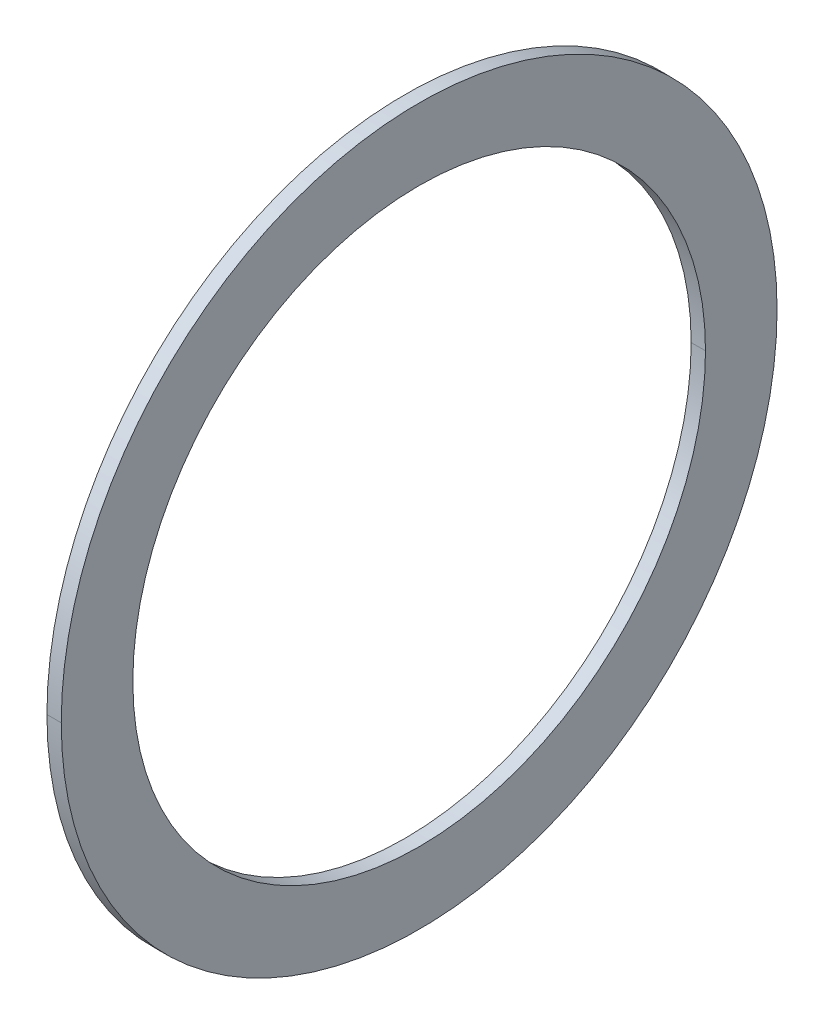
ISO-10303-21;
HEADER;
FILE_DESCRIPTION(('STEP AP214'),'2;1');
FILE_NAME('part.step','',(''),(''),'','','');
FILE_SCHEMA(('AUTOMOTIVE_DESIGN { 1 0 10303 214 1 1 1 1 }'));
ENDSEC;
DATA;
#1=APPLICATION_CONTEXT('core data for automotive mechanical design processes');
#2=APPLICATION_PROTOCOL_DEFINITION('international standard','automotive_design',2000,#1);
#3=PRODUCT_CONTEXT('',#1,'mechanical');
#4=PRODUCT('Part','Part','',(#3));
#5=PRODUCT_RELATED_PRODUCT_CATEGORY('part','',(#4));
#6=PRODUCT_DEFINITION_FORMATION('','',#4);
#7=PRODUCT_DEFINITION_CONTEXT('part definition',#1,'design');
#8=PRODUCT_DEFINITION('design','',#6,#7);
#9=PRODUCT_DEFINITION_SHAPE('','',#8);
#10=(LENGTH_UNIT() NAMED_UNIT(*) SI_UNIT(.MILLI.,.METRE.));
#11=(NAMED_UNIT(*) PLANE_ANGLE_UNIT() SI_UNIT($,.RADIAN.));
#12=(NAMED_UNIT(*) SI_UNIT($,.STERADIAN.) SOLID_ANGLE_UNIT());
#13=UNCERTAINTY_MEASURE_WITH_UNIT(LENGTH_MEASURE(1.E-05),#10,'distance_accuracy_value','');
#14=(GEOMETRIC_REPRESENTATION_CONTEXT(3) GLOBAL_UNCERTAINTY_ASSIGNED_CONTEXT((#13)) GLOBAL_UNIT_ASSIGNED_CONTEXT((#10,
#11,#12)) REPRESENTATION_CONTEXT('',''));
#15=CARTESIAN_POINT('',(0.,0.,0.));
#16=DIRECTION('',(0.,0.,1.));
#17=DIRECTION('',(1.,0.,0.));
#18=AXIS2_PLACEMENT_3D('',#15,#16,#17);
#19=CARTESIAN_POINT('',(2.,0.,0.));
#20=DIRECTION('',(-1.,0.,0.));
#21=DIRECTION('',(0.,1.,0.));
#22=AXIS2_PLACEMENT_3D('',#19,#20,#21);
#23=CYLINDRICAL_SURFACE('',#22,80.);
#24=DIRECTION('',(-1.,0.,0.));
#25=VECTOR('',#24,1.);
#26=CARTESIAN_POINT('',(2.,0.,-80.));
#27=LINE('',#26,#25);
#28=CARTESIAN_POINT('',(2.,0.,-80.));
#29=VERTEX_POINT('',#28);
#30=CARTESIAN_POINT('',(-2.,0.,-80.));
#31=VERTEX_POINT('',#30);
#32=EDGE_CURVE('E11',#29,#31,#27,.T.);
#33=ORIENTED_EDGE('',*,*,#32,.T.);
#34=CARTESIAN_POINT('',(-2.,0.,0.));
#35=DIRECTION('',(1.,0.,0.));
#36=DIRECTION('',(0.,0.,-1.));
#37=AXIS2_PLACEMENT_3D('',#34,#35,#36);
#38=CIRCLE('',#37,80.);
#39=CARTESIAN_POINT('',(-2.,0.,80.));
#40=VERTEX_POINT('',#39);
#41=EDGE_CURVE('E25',#40,#31,#38,.T.);
#42=ORIENTED_EDGE('',*,*,#41,.F.);
#43=DIRECTION('',(-1.,0.,0.));
#44=VECTOR('',#43,1.);
#45=CARTESIAN_POINT('',(2.,0.,80.));
#46=LINE('',#45,#44);
#47=CARTESIAN_POINT('',(2.,0.,80.));
#48=VERTEX_POINT('',#47);
#49=EDGE_CURVE('E94',#48,#40,#46,.T.);
#50=ORIENTED_EDGE('',*,*,#49,.F.);
#51=CARTESIAN_POINT('',(2.,0.,0.));
#52=DIRECTION('',(1.,0.,0.));
#53=DIRECTION('',(0.,0.,-1.));
#54=AXIS2_PLACEMENT_3D('',#51,#52,#53);
#55=CIRCLE('',#54,80.);
#56=EDGE_CURVE('E90',#48,#29,#55,.T.);
#57=ORIENTED_EDGE('',*,*,#56,.T.);
#58=EDGE_LOOP('',(#33,#42,#50,#57));
#59=FACE_BOUND('',#58,.T.);
#60=ADVANCED_FACE('F17',(#59),#23,.F.);
#61=CARTESIAN_POINT('',(2.,0.,0.));
#62=DIRECTION('',(1.,0.,0.));
#63=DIRECTION('',(0.,0.,-1.));
#64=AXIS2_PLACEMENT_3D('',#61,#62,#63);
#65=PLANE('',#64);
#66=ORIENTED_EDGE('',*,*,#56,.F.);
#67=CARTESIAN_POINT('',(2.,0.,0.));
#68=DIRECTION('',(1.,0.,0.));
#69=DIRECTION('',(0.,0.,-1.));
#70=AXIS2_PLACEMENT_3D('',#67,#68,#69);
#71=CIRCLE('',#70,80.);
#72=EDGE_CURVE('E85',#29,#48,#71,.T.);
#73=ORIENTED_EDGE('',*,*,#72,.F.);
#74=EDGE_LOOP('',(#66,#73));
#75=FACE_BOUND('',#74,.T.);
#76=CARTESIAN_POINT('',(2.,0.,0.));
#77=DIRECTION('',(1.,0.,0.));
#78=DIRECTION('',(0.,0.,-1.));
#79=AXIS2_PLACEMENT_3D('',#76,#77,#78);
#80=CIRCLE('',#79,100.);
#81=CARTESIAN_POINT('',(2.,0.,-100.));
#82=VERTEX_POINT('',#81);
#83=CARTESIAN_POINT('',(2.,0.,100.));
#84=VERTEX_POINT('',#83);
#85=EDGE_CURVE('E72',#82,#84,#80,.T.);
#86=ORIENTED_EDGE('',*,*,#85,.T.);
#87=CARTESIAN_POINT('',(2.,0.,0.));
#88=DIRECTION('',(1.,0.,0.));
#89=DIRECTION('',(0.,0.,-1.));
#90=AXIS2_PLACEMENT_3D('',#87,#88,#89);
#91=CIRCLE('',#90,100.);
#92=EDGE_CURVE('E73',#84,#82,#91,.T.);
#93=ORIENTED_EDGE('',*,*,#92,.T.);
#94=EDGE_LOOP('',(#86,#93));
#95=FACE_BOUND('',#94,.T.);
#96=ADVANCED_FACE('F116',(#75,#95),#65,.T.);
#97=CARTESIAN_POINT('',(2.,0.,0.));
#98=DIRECTION('',(-1.,0.,0.));
#99=DIRECTION('',(0.,1.,0.));
#100=AXIS2_PLACEMENT_3D('',#97,#98,#99);
#101=CYLINDRICAL_SURFACE('',#100,100.);
#102=DIRECTION('',(-1.,0.,0.));
#103=VECTOR('',#102,1.);
#104=CARTESIAN_POINT('',(2.,0.,-100.));
#105=LINE('',#104,#103);
#106=CARTESIAN_POINT('',(-2.,0.,-100.));
#107=VERTEX_POINT('',#106);
#108=EDGE_CURVE('E59',#82,#107,#105,.T.);
#109=ORIENTED_EDGE('',*,*,#108,.F.);
#110=ORIENTED_EDGE('',*,*,#92,.F.);
#111=DIRECTION('',(-1.,0.,0.));
#112=VECTOR('',#111,1.);
#113=CARTESIAN_POINT('',(2.,0.,100.));
#114=LINE('',#113,#112);
#115=CARTESIAN_POINT('',(-2.,0.,100.));
#116=VERTEX_POINT('',#115);
#117=EDGE_CURVE('E61',#84,#116,#114,.T.);
#118=ORIENTED_EDGE('',*,*,#117,.T.);
#119=CARTESIAN_POINT('',(-2.,0.,0.));
#120=DIRECTION('',(1.,0.,0.));
#121=DIRECTION('',(0.,0.,-1.));
#122=AXIS2_PLACEMENT_3D('',#119,#120,#121);
#123=CIRCLE('',#122,100.);
#124=EDGE_CURVE('E54',#116,#107,#123,.T.);
#125=ORIENTED_EDGE('',*,*,#124,.T.);
#126=EDGE_LOOP('',(#109,#110,#118,#125));
#127=FACE_BOUND('',#126,.T.);
#128=ADVANCED_FACE('F56',(#127),#101,.T.);
#129=CARTESIAN_POINT('',(-2.,0.,0.));
#130=DIRECTION('',(1.,0.,0.));
#131=DIRECTION('',(0.,0.,-1.));
#132=AXIS2_PLACEMENT_3D('',#129,#130,#131);
#133=PLANE('',#132);
#134=CARTESIAN_POINT('',(-2.,0.,0.));
#135=DIRECTION('',(1.,0.,0.));
#136=DIRECTION('',(0.,0.,-1.));
#137=AXIS2_PLACEMENT_3D('',#134,#135,#136);
#138=CIRCLE('',#137,80.);
#139=EDGE_CURVE('E64',#31,#40,#138,.T.);
#140=ORIENTED_EDGE('',*,*,#139,.T.);
#141=ORIENTED_EDGE('',*,*,#41,.T.);
#142=EDGE_LOOP('',(#140,#141));
#143=FACE_BOUND('',#142,.T.);
#144=ORIENTED_EDGE('',*,*,#124,.F.);
#145=CARTESIAN_POINT('',(-2.,0.,0.));
#146=DIRECTION('',(1.,0.,0.));
#147=DIRECTION('',(0.,0.,-1.));
#148=AXIS2_PLACEMENT_3D('',#145,#146,#147);
#149=CIRCLE('',#148,100.);
#150=EDGE_CURVE('E66',#107,#116,#149,.T.);
#151=ORIENTED_EDGE('',*,*,#150,.F.);
#152=EDGE_LOOP('',(#144,#151));
#153=FACE_BOUND('',#152,.T.);
#154=ADVANCED_FACE('F67',(#143,#153),#133,.F.);
#155=CARTESIAN_POINT('',(2.,0.,0.));
#156=DIRECTION('',(-1.,0.,0.));
#157=DIRECTION('',(0.,-1.,0.));
#158=AXIS2_PLACEMENT_3D('',#155,#156,#157);
#159=CYLINDRICAL_SURFACE('',#158,100.);
#160=ORIENTED_EDGE('',*,*,#108,.T.);
#161=ORIENTED_EDGE('',*,*,#150,.T.);
#162=ORIENTED_EDGE('',*,*,#117,.F.);
#163=ORIENTED_EDGE('',*,*,#85,.F.);
#164=EDGE_LOOP('',(#160,#161,#162,#163));
#165=FACE_BOUND('',#164,.T.);
#166=ADVANCED_FACE('F71',(#165),#159,.T.);
#167=CARTESIAN_POINT('',(2.,0.,0.));
#168=DIRECTION('',(-1.,0.,0.));
#169=DIRECTION('',(0.,-1.,0.));
#170=AXIS2_PLACEMENT_3D('',#167,#168,#169);
#171=CYLINDRICAL_SURFACE('',#170,80.);
#172=ORIENTED_EDGE('',*,*,#32,.F.);
#173=ORIENTED_EDGE('',*,*,#72,.T.);
#174=ORIENTED_EDGE('',*,*,#49,.T.);
#175=ORIENTED_EDGE('',*,*,#139,.F.);
#176=EDGE_LOOP('',(#172,#173,#174,#175));
#177=FACE_BOUND('',#176,.T.);
#178=ADVANCED_FACE('F112',(#177),#171,.F.);
#179=CLOSED_SHELL('',(#60,#96,#128,#154,#166,#178));
#180=MANIFOLD_SOLID_BREP('B1',#179);
#181=ADVANCED_BREP_SHAPE_REPRESENTATION('',(#18,#180),#14);
#182=SHAPE_DEFINITION_REPRESENTATION(#9,#181);
ENDSEC;
END-ISO-10303-21;
